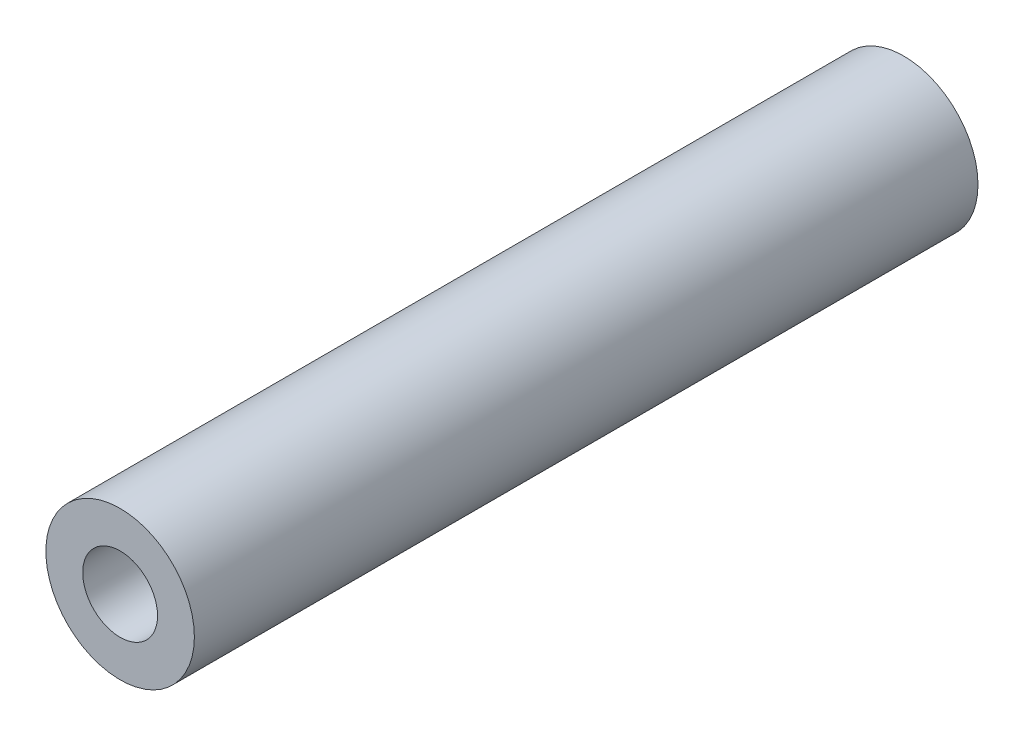
ISO-10303-21;
HEADER;
FILE_DESCRIPTION(('STEP AP214'),'2;1');
FILE_NAME('part.step','',(''),(''),'','','');
FILE_SCHEMA(('AUTOMOTIVE_DESIGN { 1 0 10303 214 1 1 1 1 }'));
ENDSEC;
DATA;
#1=APPLICATION_CONTEXT('core data for automotive mechanical design processes');
#2=APPLICATION_PROTOCOL_DEFINITION('international standard','automotive_design',2000,#1);
#3=PRODUCT_CONTEXT('',#1,'mechanical');
#4=PRODUCT('Part','Part','',(#3));
#5=PRODUCT_RELATED_PRODUCT_CATEGORY('part','',(#4));
#6=PRODUCT_DEFINITION_FORMATION('','',#4);
#7=PRODUCT_DEFINITION_CONTEXT('part definition',#1,'design');
#8=PRODUCT_DEFINITION('design','',#6,#7);
#9=PRODUCT_DEFINITION_SHAPE('','',#8);
#10=(LENGTH_UNIT() NAMED_UNIT(*) SI_UNIT(.MILLI.,.METRE.));
#11=(NAMED_UNIT(*) PLANE_ANGLE_UNIT() SI_UNIT($,.RADIAN.));
#12=(NAMED_UNIT(*) SI_UNIT($,.STERADIAN.) SOLID_ANGLE_UNIT());
#13=UNCERTAINTY_MEASURE_WITH_UNIT(LENGTH_MEASURE(1.E-05),#10,'distance_accuracy_value','');
#14=(GEOMETRIC_REPRESENTATION_CONTEXT(3) GLOBAL_UNCERTAINTY_ASSIGNED_CONTEXT((#13)) GLOBAL_UNIT_ASSIGNED_CONTEXT((#10,
#11,#12)) REPRESENTATION_CONTEXT('',''));
#15=CARTESIAN_POINT('',(0.,0.,0.));
#16=DIRECTION('',(0.,0.,1.));
#17=DIRECTION('',(1.,0.,0.));
#18=AXIS2_PLACEMENT_3D('',#15,#16,#17);
#19=CARTESIAN_POINT('',(0.,0.,33.5026));
#20=DIRECTION('',(0.,0.,1.));
#21=DIRECTION('',(1.,0.,0.));
#22=AXIS2_PLACEMENT_3D('',#19,#20,#21);
#23=PLANE('',#22);
#24=CARTESIAN_POINT('',(0.,0.,33.5026));
#25=DIRECTION('',(0.,0.,1.));
#26=DIRECTION('',(1.,0.,0.));
#27=AXIS2_PLACEMENT_3D('',#24,#25,#26);
#28=CIRCLE('',#27,6.35);
#29=CARTESIAN_POINT('',(6.35,0.,33.5026));
#30=VERTEX_POINT('',#29);
#31=EDGE_CURVE('E10',#30,#30,#28,.T.);
#32=ORIENTED_EDGE('',*,*,#31,.T.);
#33=EDGE_LOOP('',(#32));
#34=FACE_BOUND('',#33,.T.);
#35=CARTESIAN_POINT('',(0.,0.,33.5026));
#36=DIRECTION('',(0.,0.,1.));
#37=DIRECTION('',(1.,0.,0.));
#38=AXIS2_PLACEMENT_3D('',#35,#36,#37);
#39=CIRCLE('',#38,3.2004);
#40=CARTESIAN_POINT('',(3.2004,0.,33.5026));
#41=VERTEX_POINT('',#40);
#42=EDGE_CURVE('E44',#41,#41,#39,.T.);
#43=ORIENTED_EDGE('',*,*,#42,.F.);
#44=EDGE_LOOP('',(#43));
#45=FACE_BOUND('',#44,.T.);
#46=ADVANCED_FACE('F33',(#34,#45),#23,.T.);
#47=CARTESIAN_POINT('',(0.,0.,-33.5026));
#48=DIRECTION('',(0.,0.,1.));
#49=DIRECTION('',(1.,0.,0.));
#50=AXIS2_PLACEMENT_3D('',#47,#48,#49);
#51=PLANE('',#50);
#52=CARTESIAN_POINT('',(0.,0.,-33.5026));
#53=DIRECTION('',(0.,0.,1.));
#54=DIRECTION('',(1.,0.,0.));
#55=AXIS2_PLACEMENT_3D('',#52,#53,#54);
#56=CIRCLE('',#55,6.35);
#57=CARTESIAN_POINT('',(6.35,0.,-33.5026));
#58=VERTEX_POINT('',#57);
#59=EDGE_CURVE('E37',#58,#58,#56,.T.);
#60=ORIENTED_EDGE('',*,*,#59,.F.);
#61=EDGE_LOOP('',(#60));
#62=FACE_BOUND('',#61,.T.);
#63=CARTESIAN_POINT('',(0.,0.,-33.5026));
#64=DIRECTION('',(0.,0.,1.));
#65=DIRECTION('',(1.,0.,0.));
#66=AXIS2_PLACEMENT_3D('',#63,#64,#65);
#67=CIRCLE('',#66,3.2004);
#68=CARTESIAN_POINT('',(3.2004,0.,-33.5026));
#69=VERTEX_POINT('',#68);
#70=EDGE_CURVE('E46',#69,#69,#67,.T.);
#71=ORIENTED_EDGE('',*,*,#70,.T.);
#72=EDGE_LOOP('',(#71));
#73=FACE_BOUND('',#72,.T.);
#74=ADVANCED_FACE('F56',(#62,#73),#51,.F.);
#75=CARTESIAN_POINT('',(0.,0.,33.5026));
#76=DIRECTION('',(0.,0.,-1.));
#77=DIRECTION('',(-1.,0.,0.));
#78=AXIS2_PLACEMENT_3D('',#75,#76,#77);
#79=CYLINDRICAL_SURFACE('',#78,6.35);
#80=ORIENTED_EDGE('',*,*,#31,.F.);
#81=EDGE_LOOP('',(#80));
#82=FACE_BOUND('',#81,.T.);
#83=ORIENTED_EDGE('',*,*,#59,.T.);
#84=EDGE_LOOP('',(#83));
#85=FACE_BOUND('',#84,.T.);
#86=ADVANCED_FACE('F35',(#82,#85),#79,.T.);
#87=CARTESIAN_POINT('',(0.,0.,33.5026));
#88=DIRECTION('',(0.,0.,-1.));
#89=DIRECTION('',(-1.,0.,0.));
#90=AXIS2_PLACEMENT_3D('',#87,#88,#89);
#91=CYLINDRICAL_SURFACE('',#90,3.2004);
#92=ORIENTED_EDGE('',*,*,#42,.T.);
#93=EDGE_LOOP('',(#92));
#94=FACE_BOUND('',#93,.T.);
#95=ORIENTED_EDGE('',*,*,#70,.F.);
#96=EDGE_LOOP('',(#95));
#97=FACE_BOUND('',#96,.T.);
#98=ADVANCED_FACE('F52',(#94,#97),#91,.F.);
#99=CLOSED_SHELL('',(#46,#74,#86,#98));
#100=MANIFOLD_SOLID_BREP('B2',#99);
#101=ADVANCED_BREP_SHAPE_REPRESENTATION('',(#18,#100),#14);
#102=SHAPE_DEFINITION_REPRESENTATION(#9,#101);
ENDSEC;
END-ISO-10303-21;
